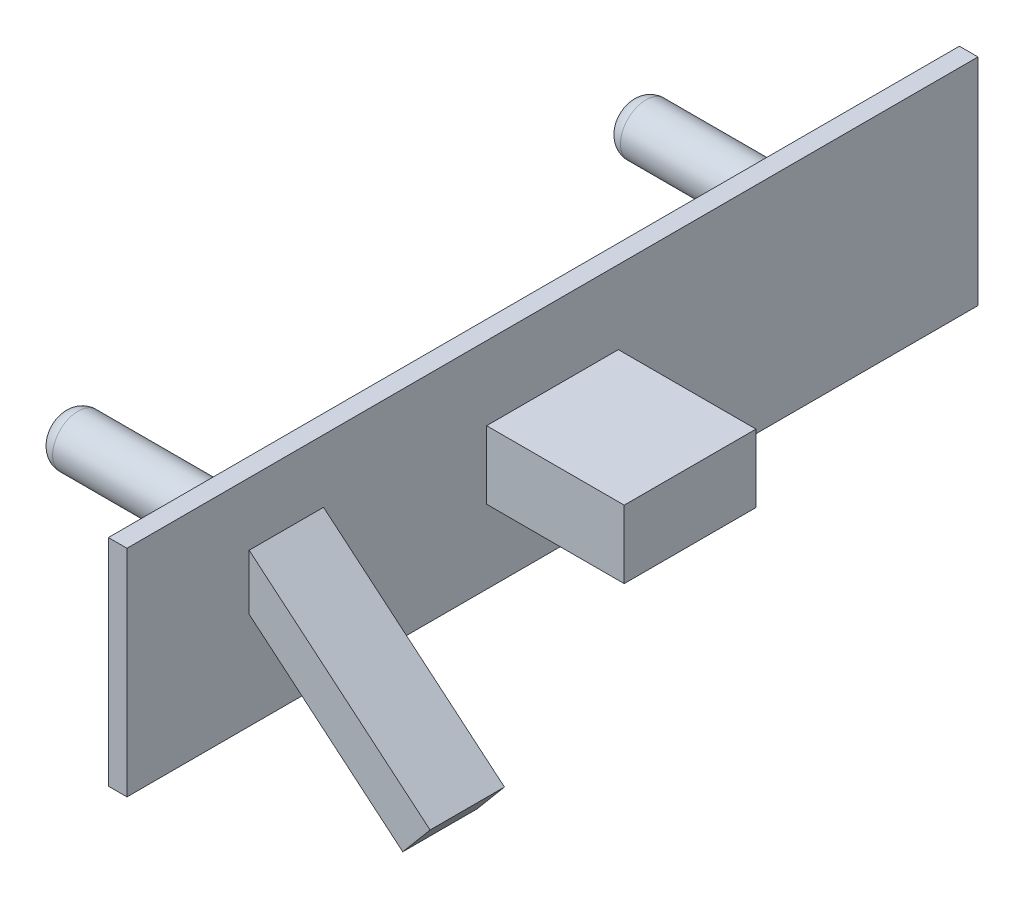
ISO-10303-21;
HEADER;
FILE_DESCRIPTION(('STEP AP214'),'2;1');
FILE_NAME('part.step','',(''),(''),'','','');
FILE_SCHEMA(('AUTOMOTIVE_DESIGN { 1 0 10303 214 1 1 1 1 }'));
ENDSEC;
DATA;
#1=APPLICATION_CONTEXT('core data for automotive mechanical design processes');
#2=APPLICATION_PROTOCOL_DEFINITION('international standard','automotive_design',2000,#1);
#3=PRODUCT_CONTEXT('',#1,'mechanical');
#4=PRODUCT('Part','Part','',(#3));
#5=PRODUCT_RELATED_PRODUCT_CATEGORY('part','',(#4));
#6=PRODUCT_DEFINITION_FORMATION('','',#4);
#7=PRODUCT_DEFINITION_CONTEXT('part definition',#1,'design');
#8=PRODUCT_DEFINITION('design','',#6,#7);
#9=PRODUCT_DEFINITION_SHAPE('','',#8);
#10=(LENGTH_UNIT() NAMED_UNIT(*) SI_UNIT(.MILLI.,.METRE.));
#11=(NAMED_UNIT(*) PLANE_ANGLE_UNIT() SI_UNIT($,.RADIAN.));
#12=(NAMED_UNIT(*) SI_UNIT($,.STERADIAN.) SOLID_ANGLE_UNIT());
#13=UNCERTAINTY_MEASURE_WITH_UNIT(LENGTH_MEASURE(1.E-05),#10,'distance_accuracy_value','');
#14=(GEOMETRIC_REPRESENTATION_CONTEXT(3) GLOBAL_UNCERTAINTY_ASSIGNED_CONTEXT((#13)) GLOBAL_UNIT_ASSIGNED_CONTEXT((#10,
#11,#12)) REPRESENTATION_CONTEXT('',''));
#15=CARTESIAN_POINT('',(0.,0.,0.));
#16=DIRECTION('',(0.,0.,1.));
#17=DIRECTION('',(1.,0.,0.));
#18=AXIS2_PLACEMENT_3D('',#15,#16,#17);
#19=CARTESIAN_POINT('',(1.75,0.,0.));
#20=DIRECTION('',(1.,0.,0.));
#21=DIRECTION('',(0.,0.,-1.));
#22=AXIS2_PLACEMENT_3D('',#19,#20,#21);
#23=PLANE('',#22);
#24=DIRECTION('',(0.,-1.,0.));
#25=VECTOR('',#24,1.);
#26=CARTESIAN_POINT('',(1.75,20.27,0.));
#27=LINE('',#26,#25);
#28=CARTESIAN_POINT('',(1.75,20.27,0.));
#29=VERTEX_POINT('',#28);
#30=CARTESIAN_POINT('',(1.75,0.,0.));
#31=VERTEX_POINT('',#30);
#32=EDGE_CURVE('E211',#29,#31,#27,.T.);
#33=ORIENTED_EDGE('',*,*,#32,.T.);
#34=DIRECTION('',(0.,0.,-1.));
#35=VECTOR('',#34,1.);
#36=CARTESIAN_POINT('',(1.75,0.,0.));
#37=LINE('',#36,#35);
#38=CARTESIAN_POINT('',(1.75,0.,-80.1));
#39=VERTEX_POINT('',#38);
#40=EDGE_CURVE('E91',#31,#39,#37,.T.);
#41=ORIENTED_EDGE('',*,*,#40,.T.);
#42=DIRECTION('',(0.,1.,0.));
#43=VECTOR('',#42,1.);
#44=CARTESIAN_POINT('',(1.75,0.,-80.1));
#45=LINE('',#44,#43);
#46=CARTESIAN_POINT('',(1.75,20.27,-80.1));
#47=VERTEX_POINT('',#46);
#48=EDGE_CURVE('E214',#39,#47,#45,.T.);
#49=ORIENTED_EDGE('',*,*,#48,.T.);
#50=DIRECTION('',(0.,0.,1.));
#51=VECTOR('',#50,1.);
#52=CARTESIAN_POINT('',(1.75,20.27,-80.1));
#53=LINE('',#52,#51);
#54=EDGE_CURVE('E62',#47,#29,#53,.T.);
#55=ORIENTED_EDGE('',*,*,#54,.T.);
#56=EDGE_LOOP('',(#33,#41,#49,#55));
#57=FACE_BOUND('',#56,.T.);
#58=DIRECTION('',(0.,0.,1.));
#59=VECTOR('',#58,1.);
#60=CARTESIAN_POINT('',(1.75,13.335,-33.85));
#61=LINE('',#60,#59);
#62=CARTESIAN_POINT('',(1.75,13.335,-46.25));
#63=VERTEX_POINT('',#62);
#64=CARTESIAN_POINT('',(1.75,13.335,-33.85));
#65=VERTEX_POINT('',#64);
#66=EDGE_CURVE('E201',#63,#65,#61,.T.);
#67=ORIENTED_EDGE('',*,*,#66,.F.);
#68=DIRECTION('',(0.,1.,0.));
#69=VECTOR('',#68,1.);
#70=CARTESIAN_POINT('',(1.75,6.935,-46.25));
#71=LINE('',#70,#69);
#72=CARTESIAN_POINT('',(1.75,6.935,-46.25));
#73=VERTEX_POINT('',#72);
#74=EDGE_CURVE('E198',#73,#63,#71,.T.);
#75=ORIENTED_EDGE('',*,*,#74,.F.);
#76=DIRECTION('',(0.,0.,-1.));
#77=VECTOR('',#76,1.);
#78=CARTESIAN_POINT('',(1.75,6.935,-33.85));
#79=LINE('',#78,#77);
#80=CARTESIAN_POINT('',(1.75,6.935,-33.85));
#81=VERTEX_POINT('',#80);
#82=EDGE_CURVE('E207',#81,#73,#79,.T.);
#83=ORIENTED_EDGE('',*,*,#82,.F.);
#84=DIRECTION('',(0.,-1.,0.));
#85=VECTOR('',#84,1.);
#86=CARTESIAN_POINT('',(1.75,6.935,-33.85));
#87=LINE('',#86,#85);
#88=EDGE_CURVE('E204',#65,#81,#87,.T.);
#89=ORIENTED_EDGE('',*,*,#88,.F.);
#90=EDGE_LOOP('',(#67,#75,#83,#89));
#91=FACE_BOUND('',#90,.T.);
#92=DIRECTION('',(0.,0.,1.));
#93=VECTOR('',#92,1.);
#94=CARTESIAN_POINT('',(1.75,9.13785102532596,-11.5));
#95=LINE('',#94,#93);
#96=CARTESIAN_POINT('',(1.75,9.13785102532596,-18.5));
#97=VERTEX_POINT('',#96);
#98=CARTESIAN_POINT('',(1.75,9.13785102532597,-11.5));
#99=VERTEX_POINT('',#98);
#100=EDGE_CURVE('E159',#97,#99,#95,.T.);
#101=ORIENTED_EDGE('',*,*,#100,.T.);
#102=DIRECTION('',(0.,1.,0.));
#103=VECTOR('',#102,1.);
#104=CARTESIAN_POINT('',(1.75,17.6645569527595,-11.5));
#105=LINE('',#104,#103);
#106=CARTESIAN_POINT('',(1.75,14.3594801826551,-11.5));
#107=VERTEX_POINT('',#106);
#108=EDGE_CURVE('E144',#99,#107,#105,.T.);
#109=ORIENTED_EDGE('',*,*,#108,.T.);
#110=DIRECTION('',(0.,0.,-1.));
#111=VECTOR('',#110,1.);
#112=CARTESIAN_POINT('',(1.75,14.3594801826551,-11.5));
#113=LINE('',#112,#111);
#114=CARTESIAN_POINT('',(1.75,14.3594801826551,-18.5));
#115=VERTEX_POINT('',#114);
#116=EDGE_CURVE('E154',#107,#115,#113,.T.);
#117=ORIENTED_EDGE('',*,*,#116,.T.);
#118=DIRECTION('',(0.,-1.,0.));
#119=VECTOR('',#118,1.);
#120=CARTESIAN_POINT('',(1.75,17.6645569527595,-18.5));
#121=LINE('',#120,#119);
#122=EDGE_CURVE('E53',#115,#97,#121,.T.);
#123=ORIENTED_EDGE('',*,*,#122,.T.);
#124=EDGE_LOOP('',(#101,#109,#117,#123));
#125=FACE_BOUND('',#124,.T.);
#126=ADVANCED_FACE('F38',(#57,#91,#125),#23,.T.);
#127=CARTESIAN_POINT('',(0.,0.,0.));
#128=DIRECTION('',(1.,0.,0.));
#129=DIRECTION('',(0.,0.,-1.));
#130=AXIS2_PLACEMENT_3D('',#127,#128,#129);
#131=PLANE('',#130);
#132=CARTESIAN_POINT('',(0.,12.55,-66.3));
#133=DIRECTION('',(1.,0.,0.));
#134=DIRECTION('',(0.,0.,-1.));
#135=AXIS2_PLACEMENT_3D('',#132,#133,#134);
#136=CIRCLE('',#135,2.4);
#137=CARTESIAN_POINT('',(0.,12.55,-68.7));
#138=VERTEX_POINT('',#137);
#139=EDGE_CURVE('E236',#138,#138,#136,.F.);
#140=ORIENTED_EDGE('',*,*,#139,.F.);
#141=EDGE_LOOP('',(#140));
#142=FACE_BOUND('',#141,.T.);
#143=CARTESIAN_POINT('',(0.,12.55,-14.2));
#144=DIRECTION('',(1.,0.,0.));
#145=DIRECTION('',(0.,0.,-1.));
#146=AXIS2_PLACEMENT_3D('',#143,#144,#145);
#147=CIRCLE('',#146,2.4);
#148=CARTESIAN_POINT('',(0.,12.55,-16.6));
#149=VERTEX_POINT('',#148);
#150=EDGE_CURVE('E233',#149,#149,#147,.F.);
#151=ORIENTED_EDGE('',*,*,#150,.F.);
#152=EDGE_LOOP('',(#151));
#153=FACE_BOUND('',#152,.T.);
#154=DIRECTION('',(0.,-1.,0.));
#155=VECTOR('',#154,1.);
#156=CARTESIAN_POINT('',(0.,20.27,0.));
#157=LINE('',#156,#155);
#158=CARTESIAN_POINT('',(0.,20.27,0.));
#159=VERTEX_POINT('',#158);
#160=CARTESIAN_POINT('',(0.,0.,0.));
#161=VERTEX_POINT('',#160);
#162=EDGE_CURVE('E210',#159,#161,#157,.T.);
#163=ORIENTED_EDGE('',*,*,#162,.F.);
#164=DIRECTION('',(0.,0.,1.));
#165=VECTOR('',#164,1.);
#166=CARTESIAN_POINT('',(0.,20.27,-80.1));
#167=LINE('',#166,#165);
#168=CARTESIAN_POINT('',(0.,20.27,-80.1));
#169=VERTEX_POINT('',#168);
#170=EDGE_CURVE('E83',#169,#159,#167,.T.);
#171=ORIENTED_EDGE('',*,*,#170,.F.);
#172=DIRECTION('',(0.,1.,0.));
#173=VECTOR('',#172,1.);
#174=CARTESIAN_POINT('',(0.,0.,-80.1));
#175=LINE('',#174,#173);
#176=CARTESIAN_POINT('',(0.,0.,-80.1));
#177=VERTEX_POINT('',#176);
#178=EDGE_CURVE('E222',#177,#169,#175,.T.);
#179=ORIENTED_EDGE('',*,*,#178,.F.);
#180=DIRECTION('',(0.,0.,-1.));
#181=VECTOR('',#180,1.);
#182=CARTESIAN_POINT('',(0.,0.,0.));
#183=LINE('',#182,#181);
#184=EDGE_CURVE('E220',#161,#177,#183,.T.);
#185=ORIENTED_EDGE('',*,*,#184,.F.);
#186=EDGE_LOOP('',(#163,#171,#179,#185));
#187=FACE_BOUND('',#186,.T.);
#188=ADVANCED_FACE('F259',(#142,#153,#187),#131,.F.);
#189=CARTESIAN_POINT('',(1.75,20.27,0.));
#190=DIRECTION('',(0.,0.,-1.));
#191=DIRECTION('',(0.,1.,0.));
#192=AXIS2_PLACEMENT_3D('',#189,#190,#191);
#193=PLANE('',#192);
#194=ORIENTED_EDGE('',*,*,#162,.T.);
#195=DIRECTION('',(-1.,0.,0.));
#196=VECTOR('',#195,1.);
#197=CARTESIAN_POINT('',(1.75,0.,0.));
#198=LINE('',#197,#196);
#199=EDGE_CURVE('E231',#31,#161,#198,.T.);
#200=ORIENTED_EDGE('',*,*,#199,.F.);
#201=ORIENTED_EDGE('',*,*,#32,.F.);
#202=DIRECTION('',(-1.,0.,0.));
#203=VECTOR('',#202,1.);
#204=CARTESIAN_POINT('',(1.75,20.27,0.));
#205=LINE('',#204,#203);
#206=EDGE_CURVE('E217',#29,#159,#205,.T.);
#207=ORIENTED_EDGE('',*,*,#206,.T.);
#208=EDGE_LOOP('',(#194,#200,#201,#207));
#209=FACE_BOUND('',#208,.T.);
#210=ADVANCED_FACE('F264',(#209),#193,.F.);
#211=CARTESIAN_POINT('',(1.75,0.,0.));
#212=DIRECTION('',(0.,1.,0.));
#213=DIRECTION('',(0.,0.,1.));
#214=AXIS2_PLACEMENT_3D('',#211,#212,#213);
#215=PLANE('',#214);
#216=ORIENTED_EDGE('',*,*,#184,.T.);
#217=DIRECTION('',(-1.,0.,0.));
#218=VECTOR('',#217,1.);
#219=CARTESIAN_POINT('',(1.75,0.,-80.1));
#220=LINE('',#219,#218);
#221=EDGE_CURVE('E228',#39,#177,#220,.T.);
#222=ORIENTED_EDGE('',*,*,#221,.F.);
#223=ORIENTED_EDGE('',*,*,#40,.F.);
#224=ORIENTED_EDGE('',*,*,#199,.T.);
#225=EDGE_LOOP('',(#216,#222,#223,#224));
#226=FACE_BOUND('',#225,.T.);
#227=ADVANCED_FACE('F278',(#226),#215,.F.);
#228=CARTESIAN_POINT('',(1.75,0.,-80.1));
#229=DIRECTION('',(0.,0.,1.));
#230=DIRECTION('',(1.,0.,0.));
#231=AXIS2_PLACEMENT_3D('',#228,#229,#230);
#232=PLANE('',#231);
#233=ORIENTED_EDGE('',*,*,#178,.T.);
#234=DIRECTION('',(-1.,0.,0.));
#235=VECTOR('',#234,1.);
#236=CARTESIAN_POINT('',(1.75,20.27,-80.1));
#237=LINE('',#236,#235);
#238=EDGE_CURVE('E226',#47,#169,#237,.T.);
#239=ORIENTED_EDGE('',*,*,#238,.F.);
#240=ORIENTED_EDGE('',*,*,#48,.F.);
#241=ORIENTED_EDGE('',*,*,#221,.T.);
#242=EDGE_LOOP('',(#233,#239,#240,#241));
#243=FACE_BOUND('',#242,.T.);
#244=ADVANCED_FACE('F275',(#243),#232,.F.);
#245=CARTESIAN_POINT('',(1.75,20.27,-80.1));
#246=DIRECTION('',(0.,-1.,0.));
#247=DIRECTION('',(0.,0.,-1.));
#248=AXIS2_PLACEMENT_3D('',#245,#246,#247);
#249=PLANE('',#248);
#250=ORIENTED_EDGE('',*,*,#170,.T.);
#251=ORIENTED_EDGE('',*,*,#206,.F.);
#252=ORIENTED_EDGE('',*,*,#54,.F.);
#253=ORIENTED_EDGE('',*,*,#238,.T.);
#254=EDGE_LOOP('',(#250,#251,#252,#253));
#255=FACE_BOUND('',#254,.T.);
#256=ADVANCED_FACE('F272',(#255),#249,.F.);
#257=CARTESIAN_POINT('',(14.7,6.935,0.));
#258=DIRECTION('',(0.,1.,0.));
#259=DIRECTION('',(0.,0.,1.));
#260=AXIS2_PLACEMENT_3D('',#257,#258,#259);
#261=PLANE('',#260);
#262=ORIENTED_EDGE('',*,*,#82,.T.);
#263=DIRECTION('',(-1.,0.,0.));
#264=VECTOR('',#263,1.);
#265=CARTESIAN_POINT('',(14.7,6.935,-46.25));
#266=LINE('',#265,#264);
#267=CARTESIAN_POINT('',(14.7,6.935,-46.25));
#268=VERTEX_POINT('',#267);
#269=EDGE_CURVE('E195',#268,#73,#266,.T.);
#270=ORIENTED_EDGE('',*,*,#269,.F.);
#271=DIRECTION('',(0.,0.,-1.));
#272=VECTOR('',#271,1.);
#273=CARTESIAN_POINT('',(14.7,6.935,0.));
#274=LINE('',#273,#272);
#275=CARTESIAN_POINT('',(14.7,6.935,-33.85));
#276=VERTEX_POINT('',#275);
#277=EDGE_CURVE('E175',#276,#268,#274,.T.);
#278=ORIENTED_EDGE('',*,*,#277,.F.);
#279=DIRECTION('',(-1.,0.,0.));
#280=VECTOR('',#279,1.);
#281=CARTESIAN_POINT('',(14.7,6.935,-33.85));
#282=LINE('',#281,#280);
#283=EDGE_CURVE('E186',#276,#81,#282,.T.);
#284=ORIENTED_EDGE('',*,*,#283,.T.);
#285=EDGE_LOOP('',(#262,#270,#278,#284));
#286=FACE_BOUND('',#285,.T.);
#287=ADVANCED_FACE('F269',(#286),#261,.F.);
#288=CARTESIAN_POINT('',(14.7,0.,-46.25));
#289=DIRECTION('',(0.,0.,1.));
#290=DIRECTION('',(1.,0.,0.));
#291=AXIS2_PLACEMENT_3D('',#288,#289,#290);
#292=PLANE('',#291);
#293=ORIENTED_EDGE('',*,*,#74,.T.);
#294=DIRECTION('',(-1.,0.,0.));
#295=VECTOR('',#294,1.);
#296=CARTESIAN_POINT('',(14.7,13.335,-46.25));
#297=LINE('',#296,#295);
#298=CARTESIAN_POINT('',(14.7,13.335,-46.25));
#299=VERTEX_POINT('',#298);
#300=EDGE_CURVE('E192',#299,#63,#297,.T.);
#301=ORIENTED_EDGE('',*,*,#300,.F.);
#302=DIRECTION('',(0.,1.,0.));
#303=VECTOR('',#302,1.);
#304=CARTESIAN_POINT('',(14.7,0.,-46.25));
#305=LINE('',#304,#303);
#306=EDGE_CURVE('E178',#268,#299,#305,.T.);
#307=ORIENTED_EDGE('',*,*,#306,.F.);
#308=ORIENTED_EDGE('',*,*,#269,.T.);
#309=EDGE_LOOP('',(#293,#301,#307,#308));
#310=FACE_BOUND('',#309,.T.);
#311=ADVANCED_FACE('F313',(#310),#292,.F.);
#312=CARTESIAN_POINT('',(14.7,13.335,0.));
#313=DIRECTION('',(0.,1.,0.));
#314=DIRECTION('',(0.,0.,1.));
#315=AXIS2_PLACEMENT_3D('',#312,#313,#314);
#316=PLANE('',#315);
#317=ORIENTED_EDGE('',*,*,#300,.T.);
#318=ORIENTED_EDGE('',*,*,#66,.T.);
#319=DIRECTION('',(-1.,0.,0.));
#320=VECTOR('',#319,1.);
#321=CARTESIAN_POINT('',(14.7,13.335,-33.85));
#322=LINE('',#321,#320);
#323=CARTESIAN_POINT('',(14.7,13.335,-33.85));
#324=VERTEX_POINT('',#323);
#325=EDGE_CURVE('E189',#324,#65,#322,.T.);
#326=ORIENTED_EDGE('',*,*,#325,.F.);
#327=DIRECTION('',(0.,0.,-1.));
#328=VECTOR('',#327,1.);
#329=CARTESIAN_POINT('',(14.7,13.335,0.));
#330=LINE('',#329,#328);
#331=EDGE_CURVE('E180',#324,#299,#330,.T.);
#332=ORIENTED_EDGE('',*,*,#331,.T.);
#333=EDGE_LOOP('',(#317,#318,#326,#332));
#334=FACE_BOUND('',#333,.T.);
#335=ADVANCED_FACE('F320',(#334),#316,.T.);
#336=CARTESIAN_POINT('',(14.7,0.,-33.85));
#337=DIRECTION('',(0.,0.,1.));
#338=DIRECTION('',(1.,0.,0.));
#339=AXIS2_PLACEMENT_3D('',#336,#337,#338);
#340=PLANE('',#339);
#341=ORIENTED_EDGE('',*,*,#325,.T.);
#342=ORIENTED_EDGE('',*,*,#88,.T.);
#343=ORIENTED_EDGE('',*,*,#283,.F.);
#344=DIRECTION('',(0.,1.,0.));
#345=VECTOR('',#344,1.);
#346=CARTESIAN_POINT('',(14.7,0.,-33.85));
#347=LINE('',#346,#345);
#348=EDGE_CURVE('E183',#276,#324,#347,.T.);
#349=ORIENTED_EDGE('',*,*,#348,.T.);
#350=EDGE_LOOP('',(#341,#342,#343,#349));
#351=FACE_BOUND('',#350,.T.);
#352=ADVANCED_FACE('F327',(#351),#340,.T.);
#353=CARTESIAN_POINT('',(14.7,0.,0.));
#354=DIRECTION('',(1.,0.,0.));
#355=DIRECTION('',(0.,0.,-1.));
#356=AXIS2_PLACEMENT_3D('',#353,#354,#355);
#357=PLANE('',#356);
#358=ORIENTED_EDGE('',*,*,#277,.T.);
#359=ORIENTED_EDGE('',*,*,#306,.T.);
#360=ORIENTED_EDGE('',*,*,#331,.F.);
#361=ORIENTED_EDGE('',*,*,#348,.F.);
#362=EDGE_LOOP('',(#358,#359,#360,#361));
#363=FACE_BOUND('',#362,.T.);
#364=ADVANCED_FACE('F335',(#363),#357,.T.);
#365=CARTESIAN_POINT('',(18.7792414670986,0.0702499483837202,-11.5));
#366=DIRECTION('',(0.,0.,-1.));
#367=DIRECTION('',(0.,1.,0.));
#368=AXIS2_PLACEMENT_3D('',#365,#366,#367);
#369=PLANE('',#368);
#370=DIRECTION('',(-0.766044443118977,0.642787609686541,0.));
#371=VECTOR('',#370,1.);
#372=CARTESIAN_POINT('',(18.7792414670986,0.0702499483837202,-11.5));
#373=LINE('',#372,#371);
#374=CARTESIAN_POINT('',(18.7792414670986,0.0702499483837202,-11.5));
#375=VERTEX_POINT('',#374);
#376=EDGE_CURVE('E139',#375,#107,#373,.T.);
#377=ORIENTED_EDGE('',*,*,#376,.T.);
#378=ORIENTED_EDGE('',*,*,#108,.F.);
#379=DIRECTION('',(-0.766044443118977,0.642787609686541,0.));
#380=VECTOR('',#379,1.);
#381=CARTESIAN_POINT('',(16.2080910283525,-2.99392782409219,-11.5));
#382=LINE('',#381,#380);
#383=CARTESIAN_POINT('',(16.2080910283525,-2.99392782409219,-11.5));
#384=VERTEX_POINT('',#383);
#385=EDGE_CURVE('E173',#384,#99,#382,.T.);
#386=ORIENTED_EDGE('',*,*,#385,.F.);
#387=DIRECTION('',(-0.64278760968654,-0.766044443118977,0.));
#388=VECTOR('',#387,1.);
#389=CARTESIAN_POINT('',(18.7792414670986,0.0702499483837202,-11.5));
#390=LINE('',#389,#388);
#391=EDGE_CURVE('E147',#375,#384,#390,.T.);
#392=ORIENTED_EDGE('',*,*,#391,.F.);
#393=EDGE_LOOP('',(#377,#378,#386,#392));
#394=FACE_BOUND('',#393,.T.);
#395=ADVANCED_FACE('F141',(#394),#369,.F.);
#396=CARTESIAN_POINT('',(16.2080910283525,-2.99392782409219,-11.5));
#397=DIRECTION('',(0.64278760968654,0.766044443118977,0.));
#398=DIRECTION('',(-0.766044443118977,0.642787609686541,0.));
#399=AXIS2_PLACEMENT_3D('',#396,#397,#398);
#400=PLANE('',#399);
#401=ORIENTED_EDGE('',*,*,#385,.T.);
#402=ORIENTED_EDGE('',*,*,#100,.F.);
#403=DIRECTION('',(-0.766044443118977,0.642787609686541,0.));
#404=VECTOR('',#403,1.);
#405=CARTESIAN_POINT('',(16.2080910283525,-2.99392782409219,-18.5));
#406=LINE('',#405,#404);
#407=CARTESIAN_POINT('',(16.2080910283525,-2.99392782409219,-18.5));
#408=VERTEX_POINT('',#407);
#409=EDGE_CURVE('E171',#408,#97,#406,.T.);
#410=ORIENTED_EDGE('',*,*,#409,.F.);
#411=DIRECTION('',(0.,0.,-1.));
#412=VECTOR('',#411,1.);
#413=CARTESIAN_POINT('',(16.2080910283525,-2.99392782409219,-11.5));
#414=LINE('',#413,#412);
#415=EDGE_CURVE('E161',#384,#408,#414,.T.);
#416=ORIENTED_EDGE('',*,*,#415,.F.);
#417=EDGE_LOOP('',(#401,#402,#410,#416));
#418=FACE_BOUND('',#417,.T.);
#419=ADVANCED_FACE('F350',(#418),#400,.F.);
#420=CARTESIAN_POINT('',(18.7792414670987,0.0702499483837219,-18.5));
#421=DIRECTION('',(0.,0.,1.));
#422=DIRECTION('',(1.,0.,0.));
#423=AXIS2_PLACEMENT_3D('',#420,#421,#422);
#424=PLANE('',#423);
#425=ORIENTED_EDGE('',*,*,#409,.T.);
#426=ORIENTED_EDGE('',*,*,#122,.F.);
#427=DIRECTION('',(-0.766044443118977,0.642787609686541,0.));
#428=VECTOR('',#427,1.);
#429=CARTESIAN_POINT('',(18.7792414670987,0.0702499483837219,-18.5));
#430=LINE('',#429,#428);
#431=CARTESIAN_POINT('',(18.7792414670987,0.0702499483837219,-18.5));
#432=VERTEX_POINT('',#431);
#433=EDGE_CURVE('E150',#432,#115,#430,.T.);
#434=ORIENTED_EDGE('',*,*,#433,.F.);
#435=DIRECTION('',(0.64278760968654,0.766044443118977,0.));
#436=VECTOR('',#435,1.);
#437=CARTESIAN_POINT('',(18.7792414670987,0.0702499483837219,-18.5));
#438=LINE('',#437,#436);
#439=EDGE_CURVE('E167',#408,#432,#438,.T.);
#440=ORIENTED_EDGE('',*,*,#439,.F.);
#441=EDGE_LOOP('',(#425,#426,#434,#440));
#442=FACE_BOUND('',#441,.T.);
#443=ADVANCED_FACE('F357',(#442),#424,.F.);
#444=CARTESIAN_POINT('',(18.7792414670986,0.0702499483837202,-11.5));
#445=DIRECTION('',(-0.642787609686541,-0.766044443118977,0.));
#446=DIRECTION('',(0.766044443118977,-0.642787609686541,0.));
#447=AXIS2_PLACEMENT_3D('',#444,#445,#446);
#448=PLANE('',#447);
#449=ORIENTED_EDGE('',*,*,#433,.T.);
#450=ORIENTED_EDGE('',*,*,#116,.F.);
#451=ORIENTED_EDGE('',*,*,#376,.F.);
#452=DIRECTION('',(0.,0.,1.));
#453=VECTOR('',#452,1.);
#454=CARTESIAN_POINT('',(18.7792414670986,0.0702499483837202,-11.5));
#455=LINE('',#454,#453);
#456=EDGE_CURVE('E151',#432,#375,#455,.T.);
#457=ORIENTED_EDGE('',*,*,#456,.F.);
#458=EDGE_LOOP('',(#449,#450,#451,#457));
#459=FACE_BOUND('',#458,.T.);
#460=ADVANCED_FACE('F155',(#459),#448,.F.);
#461=CARTESIAN_POINT('',(10.9855199160053,-9.21794570981071,0.));
#462=DIRECTION('',(0.766044443118977,-0.64278760968654,0.));
#463=DIRECTION('',(0.64278760968654,0.766044443118977,0.));
#464=AXIS2_PLACEMENT_3D('',#461,#462,#463);
#465=PLANE('',#464);
#466=ORIENTED_EDGE('',*,*,#391,.T.);
#467=ORIENTED_EDGE('',*,*,#415,.T.);
#468=ORIENTED_EDGE('',*,*,#439,.T.);
#469=ORIENTED_EDGE('',*,*,#456,.T.);
#470=EDGE_LOOP('',(#466,#467,#468,#469));
#471=FACE_BOUND('',#470,.T.);
#472=ADVANCED_FACE('F371',(#471),#465,.T.);
#473=CARTESIAN_POINT('',(-18.55,12.55,-14.2));
#474=DIRECTION('',(1.,0.,0.));
#475=DIRECTION('',(0.,0.,-1.));
#476=AXIS2_PLACEMENT_3D('',#473,#474,#475);
#477=CYLINDRICAL_SURFACE('',#476,2.4);
#478=CARTESIAN_POINT('',(-17.05,12.55,-14.2));
#479=DIRECTION('',(-1.,0.,0.));
#480=DIRECTION('',(0.,0.,1.));
#481=AXIS2_PLACEMENT_3D('',#478,#479,#480);
#482=CIRCLE('',#481,2.4);
#483=CARTESIAN_POINT('',(-17.05,12.55,-11.8));
#484=VERTEX_POINT('',#483);
#485=EDGE_CURVE('E11',#484,#484,#482,.F.);
#486=ORIENTED_EDGE('',*,*,#485,.T.);
#487=EDGE_LOOP('',(#486));
#488=FACE_BOUND('',#487,.T.);
#489=ORIENTED_EDGE('',*,*,#150,.T.);
#490=EDGE_LOOP('',(#489));
#491=FACE_BOUND('',#490,.T.);
#492=ADVANCED_FACE('F378',(#488,#491),#477,.T.);
#493=CARTESIAN_POINT('',(-18.55,0.,0.));
#494=DIRECTION('',(-1.,0.,0.));
#495=DIRECTION('',(0.,0.,1.));
#496=AXIS2_PLACEMENT_3D('',#493,#494,#495);
#497=PLANE('',#496);
#498=CARTESIAN_POINT('',(-18.55,12.55,-14.2));
#499=DIRECTION('',(-1.,0.,0.));
#500=DIRECTION('',(0.,0.,1.));
#501=AXIS2_PLACEMENT_3D('',#498,#499,#500);
#502=CIRCLE('',#501,0.900000000000001);
#503=CARTESIAN_POINT('',(-18.55,12.55,-13.3));
#504=VERTEX_POINT('',#503);
#505=EDGE_CURVE('E46',#504,#504,#502,.T.);
#506=ORIENTED_EDGE('',*,*,#505,.T.);
#507=EDGE_LOOP('',(#506));
#508=FACE_BOUND('',#507,.T.);
#509=ADVANCED_FACE('F247',(#508),#497,.T.);
#510=CARTESIAN_POINT('',(-17.2,12.55,-66.3));
#511=DIRECTION('',(1.,0.,0.));
#512=DIRECTION('',(0.,0.,-1.));
#513=AXIS2_PLACEMENT_3D('',#510,#511,#512);
#514=CYLINDRICAL_SURFACE('',#513,2.4);
#515=CARTESIAN_POINT('',(-15.7,12.55,-66.3));
#516=DIRECTION('',(-1.,0.,0.));
#517=DIRECTION('',(0.,0.,1.));
#518=AXIS2_PLACEMENT_3D('',#515,#516,#517);
#519=CIRCLE('',#518,2.4);
#520=CARTESIAN_POINT('',(-15.7,12.55,-68.7));
#521=VERTEX_POINT('',#520);
#522=EDGE_CURVE('E242',#521,#521,#519,.F.);
#523=CARTESIAN_POINT('',(-15.7,12.55,-68.7));
#524=CARTESIAN_POINT('',(-15.5364583333333,12.55,-68.7));
#525=CARTESIAN_POINT('',(-15.3729166666667,12.55,-68.7));
#526=CARTESIAN_POINT('',(-15.0458333333333,12.55,-68.7));
#527=CARTESIAN_POINT('',(-14.8822916666667,12.55,-68.7));
#528=CARTESIAN_POINT('',(-14.5552083333333,12.55,-68.7));
#529=CARTESIAN_POINT('',(-14.3916666666667,12.55,-68.7));
#530=CARTESIAN_POINT('',(-14.0645833333333,12.55,-68.7));
#531=CARTESIAN_POINT('',(-13.9010416666667,12.55,-68.7));
#532=CARTESIAN_POINT('',(-13.5739583333333,12.55,-68.7));
#533=CARTESIAN_POINT('',(-13.4104166666667,12.55,-68.7));
#534=CARTESIAN_POINT('',(-13.0833333333333,12.55,-68.7));
#535=CARTESIAN_POINT('',(-12.9197916666667,12.55,-68.7));
#536=CARTESIAN_POINT('',(-12.5927083333333,12.55,-68.7));
#537=CARTESIAN_POINT('',(-12.4291666666667,12.55,-68.7));
#538=CARTESIAN_POINT('',(-12.1020833333333,12.55,-68.7));
#539=CARTESIAN_POINT('',(-11.9385416666667,12.55,-68.7));
#540=CARTESIAN_POINT('',(-11.6114583333333,12.55,-68.7));
#541=CARTESIAN_POINT('',(-11.4479166666667,12.55,-68.7));
#542=CARTESIAN_POINT('',(-11.1208333333333,12.55,-68.7));
#543=CARTESIAN_POINT('',(-10.9572916666667,12.55,-68.7));
#544=CARTESIAN_POINT('',(-10.6302083333333,12.55,-68.7));
#545=CARTESIAN_POINT('',(-10.4666666666667,12.55,-68.7));
#546=CARTESIAN_POINT('',(-10.1395833333333,12.55,-68.7));
#547=CARTESIAN_POINT('',(-9.97604166666667,12.55,-68.7));
#548=CARTESIAN_POINT('',(-9.64895833333333,12.55,-68.7));
#549=CARTESIAN_POINT('',(-9.48541666666667,12.55,-68.7));
#550=CARTESIAN_POINT('',(-9.15833333333333,12.55,-68.7));
#551=CARTESIAN_POINT('',(-8.99479166666667,12.55,-68.7));
#552=CARTESIAN_POINT('',(-8.66770833333334,12.55,-68.7));
#553=CARTESIAN_POINT('',(-8.50416666666667,12.55,-68.7));
#554=CARTESIAN_POINT('',(-8.17708333333334,12.55,-68.7));
#555=CARTESIAN_POINT('',(-8.01354166666667,12.55,-68.7));
#556=CARTESIAN_POINT('',(-7.68645833333333,12.55,-68.7));
#557=CARTESIAN_POINT('',(-7.52291666666667,12.55,-68.7));
#558=CARTESIAN_POINT('',(-7.19583333333333,12.55,-68.7));
#559=CARTESIAN_POINT('',(-7.03229166666667,12.55,-68.7));
#560=CARTESIAN_POINT('',(-6.70520833333333,12.55,-68.7));
#561=CARTESIAN_POINT('',(-6.54166666666667,12.55,-68.7));
#562=CARTESIAN_POINT('',(-6.21458333333334,12.55,-68.7));
#563=CARTESIAN_POINT('',(-6.05104166666667,12.55,-68.7));
#564=CARTESIAN_POINT('',(-5.72395833333333,12.55,-68.7));
#565=CARTESIAN_POINT('',(-5.56041666666667,12.55,-68.7));
#566=CARTESIAN_POINT('',(-5.23333333333334,12.55,-68.7));
#567=CARTESIAN_POINT('',(-5.06979166666667,12.55,-68.7));
#568=CARTESIAN_POINT('',(-4.74270833333334,12.55,-68.7));
#569=CARTESIAN_POINT('',(-4.57916666666667,12.55,-68.7));
#570=CARTESIAN_POINT('',(-4.25208333333334,12.55,-68.7));
#571=CARTESIAN_POINT('',(-4.08854166666667,12.55,-68.7));
#572=CARTESIAN_POINT('',(-3.76145833333333,12.55,-68.7));
#573=CARTESIAN_POINT('',(-3.59791666666667,12.55,-68.7));
#574=CARTESIAN_POINT('',(-3.27083333333334,12.55,-68.7));
#575=CARTESIAN_POINT('',(-3.10729166666667,12.55,-68.7));
#576=CARTESIAN_POINT('',(-2.78020833333334,12.55,-68.7));
#577=CARTESIAN_POINT('',(-2.61666666666667,12.55,-68.7));
#578=CARTESIAN_POINT('',(-2.28958333333334,12.55,-68.7));
#579=CARTESIAN_POINT('',(-2.12604166666667,12.55,-68.7));
#580=CARTESIAN_POINT('',(-1.79895833333334,12.55,-68.7));
#581=CARTESIAN_POINT('',(-1.63541666666667,12.55,-68.7));
#582=CARTESIAN_POINT('',(-1.30833333333334,12.55,-68.7));
#583=CARTESIAN_POINT('',(-1.14479166666667,12.55,-68.7));
#584=CARTESIAN_POINT('',(-0.817708333333337,12.55,-68.7));
#585=CARTESIAN_POINT('',(-0.654166666666671,12.55,-68.7));
#586=CARTESIAN_POINT('',(-0.327083333333338,12.55,-68.7));
#587=CARTESIAN_POINT('',(-0.163541666666671,12.55,-68.7));
#588=CARTESIAN_POINT('',(0.,12.55,-68.7));
#589=B_SPLINE_CURVE_WITH_KNOTS('',3,(#523,#524,#525,#526,#527,#528,#529,#530,#531,#532,#533,
#534,#535,#536,#537,#538,#539,#540,#541,#542,#543,#544,#545,#546,#547,#548,#549,#550,#551,#552,
#553,#554,#555,#556,#557,#558,#559,#560,#561,#562,#563,#564,#565,#566,#567,#568,#569,#570,#571,
#572,#573,#574,#575,#576,#577,#578,#579,#580,#581,#582,#583,#584,#585,#586,#587,#588),
.UNSPECIFIED.,.F.,.F.,(4,2,2,2,2,2,2,2,2,2,2,2,2,2,2,2,2,2,2,2,2,2,2,2,2,2,2,2,2,2,2,2,4),(0.,
0.490624999999998,0.981249999999998,1.471875,1.9625,2.453125,2.94375,3.434375,3.925,4.415625,
4.90625,5.396875,5.8875,6.37812499999999,6.86875,7.35937499999999,7.84999999999999,
8.34062499999999,8.83124999999999,9.32187499999999,9.81249999999999,10.303125,10.79375,
11.284375,11.775,12.265625,12.75625,13.246875,13.7375,14.228125,14.71875,15.209375,15.7),.UNSPECIFIED.);
#590=EDGE_CURVE('BSEAM393',#521,#138,#589,.T.);
#591=ORIENTED_EDGE('',*,*,#522,.T.);
#592=ORIENTED_EDGE('',*,*,#139,.T.);
#593=ORIENTED_EDGE('',*,*,#590,.T.);
#594=ORIENTED_EDGE('',*,*,#590,.F.);
#595=EDGE_LOOP('',(#591,#593,#592,#594));
#596=FACE_BOUND('',#595,.T.);
#597=ADVANCED_FACE('F393',(#596),#514,.T.);
#598=CARTESIAN_POINT('',(-17.2,0.,0.));
#599=DIRECTION('',(-1.,0.,0.));
#600=DIRECTION('',(0.,0.,1.));
#601=AXIS2_PLACEMENT_3D('',#598,#599,#600);
#602=PLANE('',#601);
#603=CARTESIAN_POINT('',(-17.2,12.55,-66.3));
#604=DIRECTION('',(-1.,0.,0.));
#605=DIRECTION('',(0.,0.,1.));
#606=AXIS2_PLACEMENT_3D('',#603,#604,#605);
#607=CIRCLE('',#606,0.900000000000001);
#608=CARTESIAN_POINT('',(-17.2,12.55,-65.4));
#609=VERTEX_POINT('',#608);
#610=EDGE_CURVE('E239',#609,#609,#607,.T.);
#611=ORIENTED_EDGE('',*,*,#610,.T.);
#612=EDGE_LOOP('',(#611));
#613=FACE_BOUND('',#612,.T.);
#614=ADVANCED_FACE('F255',(#613),#602,.T.);
#615=CARTESIAN_POINT('',(-15.7,12.55,-66.3));
#616=DIRECTION('',(-1.,0.,0.));
#617=DIRECTION('',(0.,0.,1.));
#618=AXIS2_PLACEMENT_3D('',#615,#616,#617);
#619=DEGENERATE_TOROIDAL_SURFACE('',#618,0.900000000000001,1.5,.T.);
#620=ORIENTED_EDGE('',*,*,#522,.F.);
#621=EDGE_LOOP('',(#620));
#622=FACE_BOUND('',#621,.T.);
#623=ORIENTED_EDGE('',*,*,#610,.F.);
#624=EDGE_LOOP('',(#623));
#625=FACE_BOUND('',#624,.T.);
#626=ADVANCED_FACE('F250',(#622,#625),#619,.T.);
#627=CARTESIAN_POINT('',(-17.05,12.55,-14.2));
#628=DIRECTION('',(-1.,0.,0.));
#629=DIRECTION('',(0.,0.,1.));
#630=AXIS2_PLACEMENT_3D('',#627,#628,#629);
#631=DEGENERATE_TOROIDAL_SURFACE('',#630,0.900000000000001,1.5,.T.);
#632=ORIENTED_EDGE('',*,*,#485,.F.);
#633=EDGE_LOOP('',(#632));
#634=FACE_BOUND('',#633,.T.);
#635=ORIENTED_EDGE('',*,*,#505,.F.);
#636=EDGE_LOOP('',(#635));
#637=FACE_BOUND('',#636,.T.);
#638=ADVANCED_FACE('F40',(#634,#637),#631,.T.);
#639=CLOSED_SHELL('',(#126,#188,#210,#227,#244,#256,#287,#311,#335,#352,#364,#395,#419,#443,
#460,#472,#492,#509,#597,#614,#626,#638));
#640=MANIFOLD_SOLID_BREP('B2',#639);
#641=ADVANCED_BREP_SHAPE_REPRESENTATION('',(#18,#640),#14);
#642=SHAPE_DEFINITION_REPRESENTATION(#9,#641);
ENDSEC;
END-ISO-10303-21;
